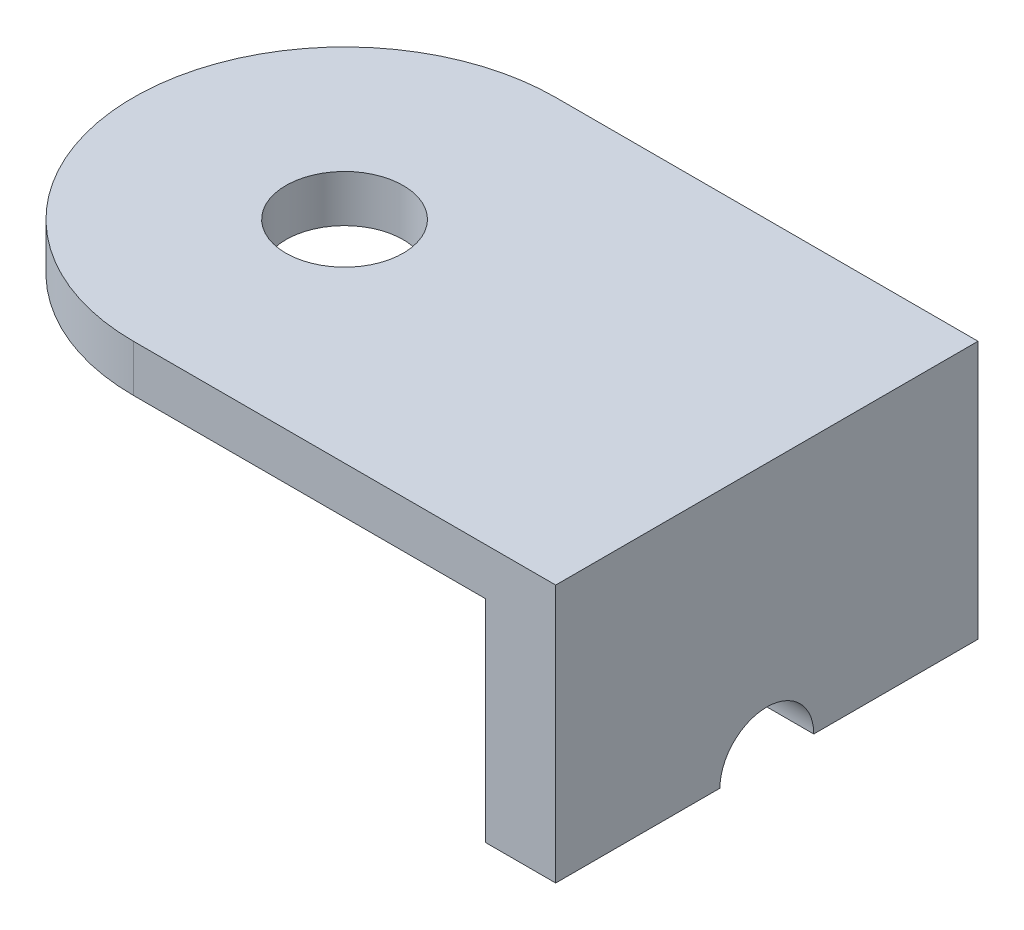
ISO-10303-21;
HEADER;
FILE_DESCRIPTION(('STEP AP214'),'2;1');
FILE_NAME('part.step','',(''),(''),'','','');
FILE_SCHEMA(('AUTOMOTIVE_DESIGN { 1 0 10303 214 1 1 1 1 }'));
ENDSEC;
DATA;
#1=APPLICATION_CONTEXT('core data for automotive mechanical design processes');
#2=APPLICATION_PROTOCOL_DEFINITION('international standard','automotive_design',2000,#1);
#3=PRODUCT_CONTEXT('',#1,'mechanical');
#4=PRODUCT('Part','Part','',(#3));
#5=PRODUCT_RELATED_PRODUCT_CATEGORY('part','',(#4));
#6=PRODUCT_DEFINITION_FORMATION('','',#4);
#7=PRODUCT_DEFINITION_CONTEXT('part definition',#1,'design');
#8=PRODUCT_DEFINITION('design','',#6,#7);
#9=PRODUCT_DEFINITION_SHAPE('','',#8);
#10=(LENGTH_UNIT() NAMED_UNIT(*) SI_UNIT(.MILLI.,.METRE.));
#11=(NAMED_UNIT(*) PLANE_ANGLE_UNIT() SI_UNIT($,.RADIAN.));
#12=(NAMED_UNIT(*) SI_UNIT($,.STERADIAN.) SOLID_ANGLE_UNIT());
#13=UNCERTAINTY_MEASURE_WITH_UNIT(LENGTH_MEASURE(1.E-05),#10,'distance_accuracy_value','');
#14=(GEOMETRIC_REPRESENTATION_CONTEXT(3) GLOBAL_UNCERTAINTY_ASSIGNED_CONTEXT((#13)) GLOBAL_UNIT_ASSIGNED_CONTEXT((#10,
#11,#12)) REPRESENTATION_CONTEXT('',''));
#15=CARTESIAN_POINT('',(0.,0.,0.));
#16=DIRECTION('',(0.,0.,1.));
#17=DIRECTION('',(1.,0.,0.));
#18=AXIS2_PLACEMENT_3D('',#15,#16,#17);
#19=CARTESIAN_POINT('',(0.,2.,0.));
#20=DIRECTION('',(0.,1.,0.));
#21=DIRECTION('',(0.,0.,1.));
#22=AXIS2_PLACEMENT_3D('',#19,#20,#21);
#23=PLANE('',#22);
#24=CARTESIAN_POINT('',(0.,2.,0.));
#25=DIRECTION('',(0.,1.,0.));
#26=DIRECTION('',(0.,0.,1.));
#27=AXIS2_PLACEMENT_3D('',#24,#25,#26);
#28=CIRCLE('',#27,9.);
#29=CARTESIAN_POINT('',(0.,2.,-9.));
#30=VERTEX_POINT('',#29);
#31=CARTESIAN_POINT('',(0.,2.,9.));
#32=VERTEX_POINT('',#31);
#33=EDGE_CURVE('E124',#30,#32,#28,.T.);
#34=ORIENTED_EDGE('',*,*,#33,.T.);
#35=DIRECTION('',(1.,0.,0.));
#36=VECTOR('',#35,1.);
#37=CARTESIAN_POINT('',(0.,2.,9.));
#38=LINE('',#37,#36);
#39=CARTESIAN_POINT('',(18.,2.,9.));
#40=VERTEX_POINT('',#39);
#41=EDGE_CURVE('E79',#32,#40,#38,.T.);
#42=ORIENTED_EDGE('',*,*,#41,.T.);
#43=DIRECTION('',(0.,0.,-1.));
#44=VECTOR('',#43,1.);
#45=CARTESIAN_POINT('',(18.,2.,-9.));
#46=LINE('',#45,#44);
#47=CARTESIAN_POINT('',(18.,2.,-9.));
#48=VERTEX_POINT('',#47);
#49=EDGE_CURVE('E143',#40,#48,#46,.T.);
#50=ORIENTED_EDGE('',*,*,#49,.T.);
#51=DIRECTION('',(-1.,0.,0.));
#52=VECTOR('',#51,1.);
#53=CARTESIAN_POINT('',(0.,2.,-9.));
#54=LINE('',#53,#52);
#55=EDGE_CURVE('E57',#48,#30,#54,.T.);
#56=ORIENTED_EDGE('',*,*,#55,.T.);
#57=EDGE_LOOP('',(#34,#42,#50,#56));
#58=FACE_BOUND('',#57,.T.);
#59=CARTESIAN_POINT('',(0.,2.,0.));
#60=DIRECTION('',(0.,1.,0.));
#61=DIRECTION('',(0.,0.,1.));
#62=AXIS2_PLACEMENT_3D('',#59,#60,#61);
#63=CIRCLE('',#62,2.5);
#64=CARTESIAN_POINT('',(0.,2.,2.5));
#65=VERTEX_POINT('',#64);
#66=EDGE_CURVE('E166',#65,#65,#63,.T.);
#67=ORIENTED_EDGE('',*,*,#66,.F.);
#68=EDGE_LOOP('',(#67));
#69=FACE_BOUND('',#68,.T.);
#70=ADVANCED_FACE('F33',(#58,#69),#23,.T.);
#71=CARTESIAN_POINT('',(0.,0.,0.));
#72=DIRECTION('',(0.,1.,0.));
#73=DIRECTION('',(0.,0.,1.));
#74=AXIS2_PLACEMENT_3D('',#71,#72,#73);
#75=PLANE('',#74);
#76=DIRECTION('',(-1.,0.,0.));
#77=VECTOR('',#76,1.);
#78=CARTESIAN_POINT('',(0.,0.,-9.));
#79=LINE('',#78,#77);
#80=CARTESIAN_POINT('',(15.,0.,-9.));
#81=VERTEX_POINT('',#80);
#82=CARTESIAN_POINT('',(0.,0.,-9.));
#83=VERTEX_POINT('',#82);
#84=EDGE_CURVE('E72',#81,#83,#79,.T.);
#85=ORIENTED_EDGE('',*,*,#84,.F.);
#86=DIRECTION('',(0.,0.,1.));
#87=VECTOR('',#86,1.);
#88=CARTESIAN_POINT('',(15.,0.,-9.));
#89=LINE('',#88,#87);
#90=CARTESIAN_POINT('',(15.,0.,9.));
#91=VERTEX_POINT('',#90);
#92=EDGE_CURVE('E106',#81,#91,#89,.T.);
#93=ORIENTED_EDGE('',*,*,#92,.T.);
#94=DIRECTION('',(1.,0.,0.));
#95=VECTOR('',#94,1.);
#96=CARTESIAN_POINT('',(0.,0.,9.));
#97=LINE('',#96,#95);
#98=CARTESIAN_POINT('',(0.,0.,9.));
#99=VERTEX_POINT('',#98);
#100=EDGE_CURVE('E125',#99,#91,#97,.T.);
#101=ORIENTED_EDGE('',*,*,#100,.F.);
#102=CARTESIAN_POINT('',(0.,0.,0.));
#103=DIRECTION('',(0.,1.,0.));
#104=DIRECTION('',(0.,0.,1.));
#105=AXIS2_PLACEMENT_3D('',#102,#103,#104);
#106=CIRCLE('',#105,9.);
#107=EDGE_CURVE('E123',#83,#99,#106,.T.);
#108=ORIENTED_EDGE('',*,*,#107,.F.);
#109=EDGE_LOOP('',(#85,#93,#101,#108));
#110=FACE_BOUND('',#109,.T.);
#111=CARTESIAN_POINT('',(0.,0.,0.));
#112=DIRECTION('',(0.,1.,0.));
#113=DIRECTION('',(0.,0.,1.));
#114=AXIS2_PLACEMENT_3D('',#111,#112,#113);
#115=CIRCLE('',#114,2.5);
#116=CARTESIAN_POINT('',(0.,0.,2.5));
#117=VERTEX_POINT('',#116);
#118=EDGE_CURVE('E162',#117,#117,#115,.T.);
#119=ORIENTED_EDGE('',*,*,#118,.T.);
#120=EDGE_LOOP('',(#119));
#121=FACE_BOUND('',#120,.T.);
#122=ADVANCED_FACE('F120',(#110,#121),#75,.F.);
#123=CARTESIAN_POINT('',(0.,2.,0.));
#124=DIRECTION('',(0.,-1.,0.));
#125=DIRECTION('',(0.,0.,-1.));
#126=AXIS2_PLACEMENT_3D('',#123,#124,#125);
#127=CYLINDRICAL_SURFACE('',#126,9.);
#128=ORIENTED_EDGE('',*,*,#107,.T.);
#129=DIRECTION('',(0.,-1.,0.));
#130=VECTOR('',#129,1.);
#131=CARTESIAN_POINT('',(0.,2.,9.));
#132=LINE('',#131,#130);
#133=EDGE_CURVE('E11',#32,#99,#132,.T.);
#134=ORIENTED_EDGE('',*,*,#133,.F.);
#135=ORIENTED_EDGE('',*,*,#33,.F.);
#136=DIRECTION('',(0.,-1.,0.));
#137=VECTOR('',#136,1.);
#138=CARTESIAN_POINT('',(0.,2.,-9.));
#139=LINE('',#138,#137);
#140=EDGE_CURVE('E131',#30,#83,#139,.T.);
#141=ORIENTED_EDGE('',*,*,#140,.T.);
#142=EDGE_LOOP('',(#128,#134,#135,#141));
#143=FACE_BOUND('',#142,.T.);
#144=ADVANCED_FACE('F35',(#143),#127,.T.);
#145=CARTESIAN_POINT('',(0.,2.,9.));
#146=DIRECTION('',(0.,0.,-1.));
#147=DIRECTION('',(-1.,0.,0.));
#148=AXIS2_PLACEMENT_3D('',#145,#146,#147);
#149=PLANE('',#148);
#150=ORIENTED_EDGE('',*,*,#100,.T.);
#151=DIRECTION('',(0.,-1.,0.));
#152=VECTOR('',#151,1.);
#153=CARTESIAN_POINT('',(15.,0.,9.));
#154=LINE('',#153,#152);
#155=CARTESIAN_POINT('',(15.,-9.,9.));
#156=VERTEX_POINT('',#155);
#157=EDGE_CURVE('E48',#91,#156,#154,.T.);
#158=ORIENTED_EDGE('',*,*,#157,.T.);
#159=DIRECTION('',(1.,0.,0.));
#160=VECTOR('',#159,1.);
#161=CARTESIAN_POINT('',(15.,-9.,9.));
#162=LINE('',#161,#160);
#163=CARTESIAN_POINT('',(18.,-9.,9.));
#164=VERTEX_POINT('',#163);
#165=EDGE_CURVE('E144',#156,#164,#162,.T.);
#166=ORIENTED_EDGE('',*,*,#165,.T.);
#167=DIRECTION('',(0.,-1.,0.));
#168=VECTOR('',#167,1.);
#169=CARTESIAN_POINT('',(18.,2.,9.));
#170=LINE('',#169,#168);
#171=EDGE_CURVE('E41',#40,#164,#170,.T.);
#172=ORIENTED_EDGE('',*,*,#171,.F.);
#173=ORIENTED_EDGE('',*,*,#41,.F.);
#174=ORIENTED_EDGE('',*,*,#133,.T.);
#175=EDGE_LOOP('',(#150,#158,#166,#172,#173,#174));
#176=FACE_BOUND('',#175,.T.);
#177=ADVANCED_FACE('F145',(#176),#149,.F.);
#178=CARTESIAN_POINT('',(18.,2.,-9.));
#179=DIRECTION('',(-1.,0.,0.));
#180=DIRECTION('',(0.,0.,1.));
#181=AXIS2_PLACEMENT_3D('',#178,#179,#180);
#182=PLANE('',#181);
#183=ORIENTED_EDGE('',*,*,#171,.T.);
#184=DIRECTION('',(0.,0.,-1.));
#185=VECTOR('',#184,1.);
#186=CARTESIAN_POINT('',(18.,-9.,2.));
#187=LINE('',#186,#185);
#188=CARTESIAN_POINT('',(18.,-9.,2.));
#189=VERTEX_POINT('',#188);
#190=EDGE_CURVE('E141',#164,#189,#187,.T.);
#191=ORIENTED_EDGE('',*,*,#190,.T.);
#192=CARTESIAN_POINT('',(18.,-9.,0.));
#193=DIRECTION('',(-1.,0.,0.));
#194=DIRECTION('',(0.,0.,-1.));
#195=AXIS2_PLACEMENT_3D('',#192,#193,#194);
#196=CIRCLE('',#195,2.);
#197=CARTESIAN_POINT('',(18.,-9.,-2.));
#198=VERTEX_POINT('',#197);
#199=EDGE_CURVE('E153',#189,#198,#196,.T.);
#200=ORIENTED_EDGE('',*,*,#199,.T.);
#201=DIRECTION('',(0.,0.,-1.));
#202=VECTOR('',#201,1.);
#203=CARTESIAN_POINT('',(18.,-9.,-9.));
#204=LINE('',#203,#202);
#205=CARTESIAN_POINT('',(18.,-9.,-9.));
#206=VERTEX_POINT('',#205);
#207=EDGE_CURVE('E117',#198,#206,#204,.T.);
#208=ORIENTED_EDGE('',*,*,#207,.T.);
#209=DIRECTION('',(0.,-1.,0.));
#210=VECTOR('',#209,1.);
#211=CARTESIAN_POINT('',(18.,2.,-9.));
#212=LINE('',#211,#210);
#213=EDGE_CURVE('E133',#48,#206,#212,.T.);
#214=ORIENTED_EDGE('',*,*,#213,.F.);
#215=ORIENTED_EDGE('',*,*,#49,.F.);
#216=EDGE_LOOP('',(#183,#191,#200,#208,#214,#215));
#217=FACE_BOUND('',#216,.T.);
#218=ADVANCED_FACE('F138',(#217),#182,.F.);
#219=CARTESIAN_POINT('',(0.,2.,-9.));
#220=DIRECTION('',(0.,0.,1.));
#221=DIRECTION('',(1.,0.,0.));
#222=AXIS2_PLACEMENT_3D('',#219,#220,#221);
#223=PLANE('',#222);
#224=ORIENTED_EDGE('',*,*,#213,.T.);
#225=DIRECTION('',(1.,0.,0.));
#226=VECTOR('',#225,1.);
#227=CARTESIAN_POINT('',(15.,-9.,-9.));
#228=LINE('',#227,#226);
#229=CARTESIAN_POINT('',(15.,-9.,-9.));
#230=VERTEX_POINT('',#229);
#231=EDGE_CURVE('E116',#230,#206,#228,.T.);
#232=ORIENTED_EDGE('',*,*,#231,.F.);
#233=DIRECTION('',(0.,1.,0.));
#234=VECTOR('',#233,1.);
#235=CARTESIAN_POINT('',(15.,0.,-9.));
#236=LINE('',#235,#234);
#237=EDGE_CURVE('E109',#230,#81,#236,.T.);
#238=ORIENTED_EDGE('',*,*,#237,.T.);
#239=ORIENTED_EDGE('',*,*,#84,.T.);
#240=ORIENTED_EDGE('',*,*,#140,.F.);
#241=ORIENTED_EDGE('',*,*,#55,.F.);
#242=EDGE_LOOP('',(#224,#232,#238,#239,#240,#241));
#243=FACE_BOUND('',#242,.T.);
#244=ADVANCED_FACE('F114',(#243),#223,.F.);
#245=CARTESIAN_POINT('',(0.,2.,0.));
#246=DIRECTION('',(0.,-1.,0.));
#247=DIRECTION('',(0.,0.,-1.));
#248=AXIS2_PLACEMENT_3D('',#245,#246,#247);
#249=CYLINDRICAL_SURFACE('',#248,2.5);
#250=ORIENTED_EDGE('',*,*,#66,.T.);
#251=EDGE_LOOP('',(#250));
#252=FACE_BOUND('',#251,.T.);
#253=ORIENTED_EDGE('',*,*,#118,.F.);
#254=EDGE_LOOP('',(#253));
#255=FACE_BOUND('',#254,.T.);
#256=ADVANCED_FACE('F194',(#252,#255),#249,.F.);
#257=CARTESIAN_POINT('',(15.,-9.,-9.));
#258=DIRECTION('',(0.,-1.,0.));
#259=DIRECTION('',(0.,0.,-1.));
#260=AXIS2_PLACEMENT_3D('',#257,#258,#259);
#261=PLANE('',#260);
#262=ORIENTED_EDGE('',*,*,#207,.F.);
#263=DIRECTION('',(1.,0.,0.));
#264=VECTOR('',#263,1.);
#265=CARTESIAN_POINT('',(15.,-9.,-2.));
#266=LINE('',#265,#264);
#267=CARTESIAN_POINT('',(15.,-9.,-2.));
#268=VERTEX_POINT('',#267);
#269=EDGE_CURVE('E163',#268,#198,#266,.T.);
#270=ORIENTED_EDGE('',*,*,#269,.F.);
#271=DIRECTION('',(0.,0.,-1.));
#272=VECTOR('',#271,1.);
#273=CARTESIAN_POINT('',(15.,-9.,-9.));
#274=LINE('',#273,#272);
#275=EDGE_CURVE('E149',#268,#230,#274,.T.);
#276=ORIENTED_EDGE('',*,*,#275,.T.);
#277=ORIENTED_EDGE('',*,*,#231,.T.);
#278=EDGE_LOOP('',(#262,#270,#276,#277));
#279=FACE_BOUND('',#278,.T.);
#280=ADVANCED_FACE('F178',(#279),#261,.T.);
#281=CARTESIAN_POINT('',(15.,-9.,0.));
#282=DIRECTION('',(1.,0.,0.));
#283=DIRECTION('',(0.,0.,-1.));
#284=AXIS2_PLACEMENT_3D('',#281,#282,#283);
#285=CYLINDRICAL_SURFACE('',#284,2.);
#286=ORIENTED_EDGE('',*,*,#199,.F.);
#287=DIRECTION('',(1.,0.,0.));
#288=VECTOR('',#287,1.);
#289=CARTESIAN_POINT('',(15.,-9.,2.));
#290=LINE('',#289,#288);
#291=CARTESIAN_POINT('',(15.,-9.,2.));
#292=VERTEX_POINT('',#291);
#293=EDGE_CURVE('E148',#292,#189,#290,.T.);
#294=ORIENTED_EDGE('',*,*,#293,.F.);
#295=CARTESIAN_POINT('',(15.,-9.,0.));
#296=DIRECTION('',(-1.,0.,0.));
#297=DIRECTION('',(0.,0.,-1.));
#298=AXIS2_PLACEMENT_3D('',#295,#296,#297);
#299=CIRCLE('',#298,2.);
#300=EDGE_CURVE('E183',#292,#268,#299,.T.);
#301=ORIENTED_EDGE('',*,*,#300,.T.);
#302=ORIENTED_EDGE('',*,*,#269,.T.);
#303=EDGE_LOOP('',(#286,#294,#301,#302));
#304=FACE_BOUND('',#303,.T.);
#305=ADVANCED_FACE('F180',(#304),#285,.F.);
#306=CARTESIAN_POINT('',(15.,-9.,2.));
#307=DIRECTION('',(0.,-1.,0.));
#308=DIRECTION('',(0.,0.,-1.));
#309=AXIS2_PLACEMENT_3D('',#306,#307,#308);
#310=PLANE('',#309);
#311=ORIENTED_EDGE('',*,*,#190,.F.);
#312=ORIENTED_EDGE('',*,*,#165,.F.);
#313=DIRECTION('',(0.,0.,-1.));
#314=VECTOR('',#313,1.);
#315=CARTESIAN_POINT('',(15.,-9.,2.));
#316=LINE('',#315,#314);
#317=EDGE_CURVE('E184',#156,#292,#316,.T.);
#318=ORIENTED_EDGE('',*,*,#317,.T.);
#319=ORIENTED_EDGE('',*,*,#293,.T.);
#320=EDGE_LOOP('',(#311,#312,#318,#319));
#321=FACE_BOUND('',#320,.T.);
#322=ADVANCED_FACE('F151',(#321),#310,.T.);
#323=CARTESIAN_POINT('',(15.,-9.,0.));
#324=DIRECTION('',(1.,0.,0.));
#325=DIRECTION('',(0.,0.,-1.));
#326=AXIS2_PLACEMENT_3D('',#323,#324,#325);
#327=PLANE('',#326);
#328=ORIENTED_EDGE('',*,*,#237,.F.);
#329=ORIENTED_EDGE('',*,*,#275,.F.);
#330=ORIENTED_EDGE('',*,*,#300,.F.);
#331=ORIENTED_EDGE('',*,*,#317,.F.);
#332=ORIENTED_EDGE('',*,*,#157,.F.);
#333=ORIENTED_EDGE('',*,*,#92,.F.);
#334=EDGE_LOOP('',(#328,#329,#330,#331,#332,#333));
#335=FACE_BOUND('',#334,.T.);
#336=ADVANCED_FACE('F107',(#335),#327,.F.);
#337=CLOSED_SHELL('',(#70,#122,#144,#177,#218,#244,#256,#280,#305,#322,#336));
#338=MANIFOLD_SOLID_BREP('B2',#337);
#339=ADVANCED_BREP_SHAPE_REPRESENTATION('',(#18,#338),#14);
#340=SHAPE_DEFINITION_REPRESENTATION(#9,#339);
ENDSEC;
END-ISO-10303-21;
